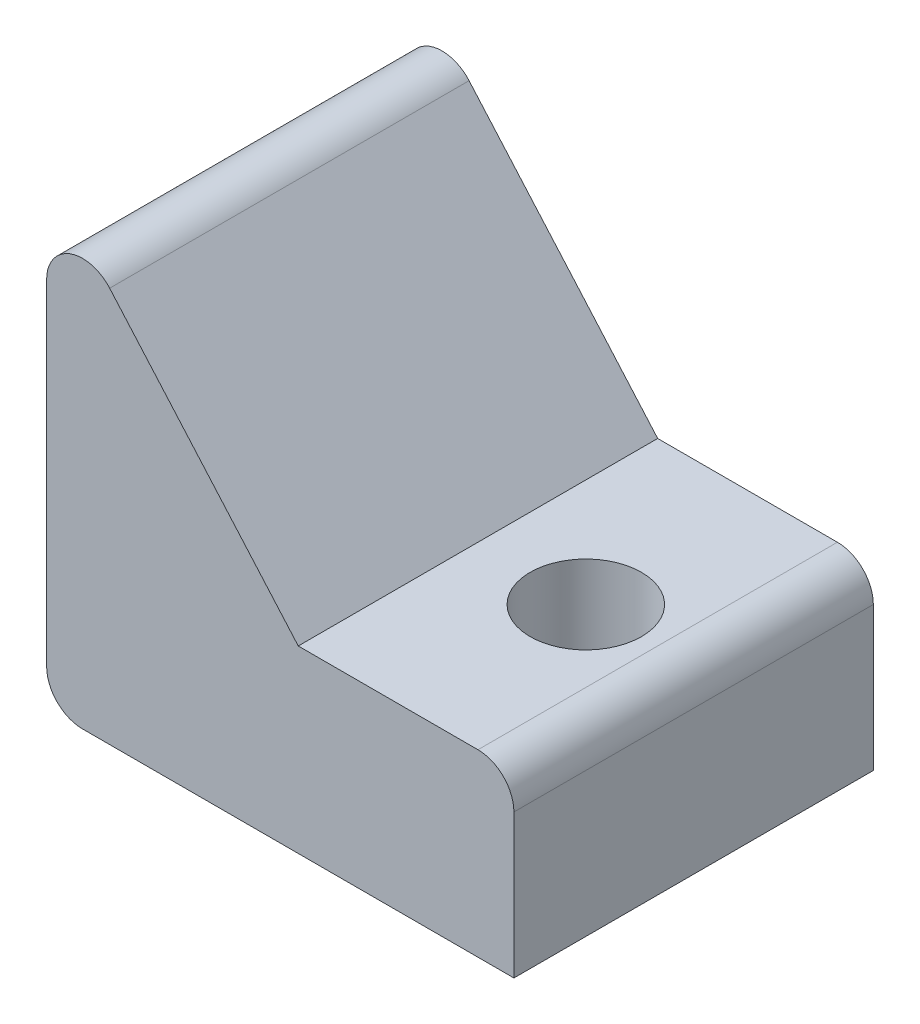
ISO-10303-21;
HEADER;
FILE_DESCRIPTION(('STEP AP214'),'2;1');
FILE_NAME('part.step','',(''),(''),'','','');
FILE_SCHEMA(('AUTOMOTIVE_DESIGN { 1 0 10303 214 1 1 1 1 }'));
ENDSEC;
DATA;
#1=APPLICATION_CONTEXT('core data for automotive mechanical design processes');
#2=APPLICATION_PROTOCOL_DEFINITION('international standard','automotive_design',2000,#1);
#3=PRODUCT_CONTEXT('',#1,'mechanical');
#4=PRODUCT('Part','Part','',(#3));
#5=PRODUCT_RELATED_PRODUCT_CATEGORY('part','',(#4));
#6=PRODUCT_DEFINITION_FORMATION('','',#4);
#7=PRODUCT_DEFINITION_CONTEXT('part definition',#1,'design');
#8=PRODUCT_DEFINITION('design','',#6,#7);
#9=PRODUCT_DEFINITION_SHAPE('','',#8);
#10=(LENGTH_UNIT() NAMED_UNIT(*) SI_UNIT(.MILLI.,.METRE.));
#11=(NAMED_UNIT(*) PLANE_ANGLE_UNIT() SI_UNIT($,.RADIAN.));
#12=(NAMED_UNIT(*) SI_UNIT($,.STERADIAN.) SOLID_ANGLE_UNIT());
#13=UNCERTAINTY_MEASURE_WITH_UNIT(LENGTH_MEASURE(1.E-05),#10,'distance_accuracy_value','');
#14=(GEOMETRIC_REPRESENTATION_CONTEXT(3) GLOBAL_UNCERTAINTY_ASSIGNED_CONTEXT((#13)) GLOBAL_UNIT_ASSIGNED_CONTEXT((#10,
#11,#12)) REPRESENTATION_CONTEXT('',''));
#15=CARTESIAN_POINT('',(0.,0.,0.));
#16=DIRECTION('',(0.,0.,1.));
#17=DIRECTION('',(1.,0.,0.));
#18=AXIS2_PLACEMENT_3D('',#15,#16,#17);
#19=CARTESIAN_POINT('',(13.,0.,5.));
#20=DIRECTION('',(-1.,0.,0.));
#21=DIRECTION('',(0.,0.,1.));
#22=AXIS2_PLACEMENT_3D('',#19,#20,#21);
#23=PLANE('',#22);
#24=DIRECTION('',(0.,1.,0.));
#25=VECTOR('',#24,1.);
#26=CARTESIAN_POINT('',(13.,0.,-5.));
#27=LINE('',#26,#25);
#28=CARTESIAN_POINT('',(13.,0.,-5.));
#29=VERTEX_POINT('',#28);
#30=CARTESIAN_POINT('',(13.,4.,-5.));
#31=VERTEX_POINT('',#30);
#32=EDGE_CURVE('E140',#29,#31,#27,.T.);
#33=ORIENTED_EDGE('',*,*,#32,.T.);
#34=DIRECTION('',(0.,0.,-1.));
#35=VECTOR('',#34,1.);
#36=CARTESIAN_POINT('',(13.,4.,5.));
#37=LINE('',#36,#35);
#38=CARTESIAN_POINT('',(13.,4.,5.));
#39=VERTEX_POINT('',#38);
#40=EDGE_CURVE('E11',#39,#31,#37,.T.);
#41=ORIENTED_EDGE('',*,*,#40,.F.);
#42=DIRECTION('',(0.,1.,0.));
#43=VECTOR('',#42,1.);
#44=CARTESIAN_POINT('',(13.,0.,5.));
#45=LINE('',#44,#43);
#46=CARTESIAN_POINT('',(13.,0.,5.));
#47=VERTEX_POINT('',#46);
#48=EDGE_CURVE('E163',#47,#39,#45,.T.);
#49=ORIENTED_EDGE('',*,*,#48,.F.);
#50=DIRECTION('',(0.,0.,-1.));
#51=VECTOR('',#50,1.);
#52=CARTESIAN_POINT('',(13.,0.,5.));
#53=LINE('',#52,#51);
#54=EDGE_CURVE('E136',#47,#29,#53,.T.);
#55=ORIENTED_EDGE('',*,*,#54,.T.);
#56=EDGE_LOOP('',(#33,#41,#49,#55));
#57=FACE_BOUND('',#56,.T.);
#58=ADVANCED_FACE('F39',(#57),#23,.F.);
#59=CARTESIAN_POINT('',(12.,4.,5.));
#60=DIRECTION('',(0.,0.,-1.));
#61=DIRECTION('',(-1.,0.,0.));
#62=AXIS2_PLACEMENT_3D('',#59,#60,#61);
#63=CYLINDRICAL_SURFACE('',#62,1.);
#64=CARTESIAN_POINT('',(12.,4.,-5.));
#65=DIRECTION('',(0.,0.,1.));
#66=DIRECTION('',(1.,0.,0.));
#67=AXIS2_PLACEMENT_3D('',#64,#65,#66);
#68=CIRCLE('',#67,1.);
#69=CARTESIAN_POINT('',(12.,5.,-5.));
#70=VERTEX_POINT('',#69);
#71=EDGE_CURVE('E144',#31,#70,#68,.T.);
#72=ORIENTED_EDGE('',*,*,#71,.T.);
#73=DIRECTION('',(0.,0.,-1.));
#74=VECTOR('',#73,1.);
#75=CARTESIAN_POINT('',(12.,5.,5.));
#76=LINE('',#75,#74);
#77=CARTESIAN_POINT('',(12.,5.,5.));
#78=VERTEX_POINT('',#77);
#79=EDGE_CURVE('E48',#78,#70,#76,.T.);
#80=ORIENTED_EDGE('',*,*,#79,.F.);
#81=CARTESIAN_POINT('',(12.,4.,5.));
#82=DIRECTION('',(0.,0.,1.));
#83=DIRECTION('',(1.,0.,0.));
#84=AXIS2_PLACEMENT_3D('',#81,#82,#83);
#85=CIRCLE('',#84,1.);
#86=EDGE_CURVE('E99',#39,#78,#85,.T.);
#87=ORIENTED_EDGE('',*,*,#86,.F.);
#88=ORIENTED_EDGE('',*,*,#40,.T.);
#89=EDGE_LOOP('',(#72,#80,#87,#88));
#90=FACE_BOUND('',#89,.T.);
#91=ADVANCED_FACE('F229',(#90),#63,.T.);
#92=CARTESIAN_POINT('',(12.,5.,5.));
#93=DIRECTION('',(0.,-1.,0.));
#94=DIRECTION('',(1.,0.,0.));
#95=AXIS2_PLACEMENT_3D('',#92,#93,#94);
#96=PLANE('',#95);
#97=CARTESIAN_POINT('',(10.,5.,0.));
#98=DIRECTION('',(0.,-1.,0.));
#99=DIRECTION('',(1.,0.,0.));
#100=AXIS2_PLACEMENT_3D('',#97,#98,#99);
#101=CIRCLE('',#100,1.55);
#102=CARTESIAN_POINT('',(11.55,5.,0.));
#103=VERTEX_POINT('',#102);
#104=EDGE_CURVE('E145',#103,#103,#101,.T.);
#105=ORIENTED_EDGE('',*,*,#104,.T.);
#106=EDGE_LOOP('',(#105));
#107=FACE_BOUND('',#106,.T.);
#108=DIRECTION('',(-1.,0.,0.));
#109=VECTOR('',#108,1.);
#110=CARTESIAN_POINT('',(12.,5.,-5.));
#111=LINE('',#110,#109);
#112=CARTESIAN_POINT('',(7.,5.,-5.));
#113=VERTEX_POINT('',#112);
#114=EDGE_CURVE('E148',#70,#113,#111,.T.);
#115=ORIENTED_EDGE('',*,*,#114,.T.);
#116=DIRECTION('',(0.,0.,-1.));
#117=VECTOR('',#116,1.);
#118=CARTESIAN_POINT('',(7.,5.,5.));
#119=LINE('',#118,#117);
#120=CARTESIAN_POINT('',(7.,5.,5.));
#121=VERTEX_POINT('',#120);
#122=EDGE_CURVE('E174',#121,#113,#119,.T.);
#123=ORIENTED_EDGE('',*,*,#122,.F.);
#124=DIRECTION('',(-1.,0.,0.));
#125=VECTOR('',#124,1.);
#126=CARTESIAN_POINT('',(12.,5.,5.));
#127=LINE('',#126,#125);
#128=EDGE_CURVE('E184',#78,#121,#127,.T.);
#129=ORIENTED_EDGE('',*,*,#128,.F.);
#130=ORIENTED_EDGE('',*,*,#79,.T.);
#131=EDGE_LOOP('',(#115,#123,#129,#130));
#132=FACE_BOUND('',#131,.T.);
#133=ADVANCED_FACE('F182',(#107,#132),#96,.F.);
#134=CARTESIAN_POINT('',(1.75257669470688,10.9970552060493,5.));
#135=DIRECTION('',(-0.752576694706878,-0.658504607868518,0.));
#136=DIRECTION('',(0.658504607868518,-0.752576694706878,0.));
#137=AXIS2_PLACEMENT_3D('',#134,#135,#136);
#138=PLANE('',#137);
#139=DIRECTION('',(-0.658504607868518,0.752576694706878,0.));
#140=VECTOR('',#139,1.);
#141=CARTESIAN_POINT('',(1.75257669470688,10.9970552060493,-5.));
#142=LINE('',#141,#140);
#143=CARTESIAN_POINT('',(1.75257669470688,10.9970552060493,-5.));
#144=VERTEX_POINT('',#143);
#145=EDGE_CURVE('E151',#113,#144,#142,.T.);
#146=ORIENTED_EDGE('',*,*,#145,.T.);
#147=DIRECTION('',(0.,0.,-1.));
#148=VECTOR('',#147,1.);
#149=CARTESIAN_POINT('',(1.75257669470688,10.9970552060493,5.));
#150=LINE('',#149,#148);
#151=CARTESIAN_POINT('',(1.75257669470688,10.9970552060493,5.));
#152=VERTEX_POINT('',#151);
#153=EDGE_CURVE('E170',#152,#144,#150,.T.);
#154=ORIENTED_EDGE('',*,*,#153,.F.);
#155=DIRECTION('',(-0.658504607868518,0.752576694706878,0.));
#156=VECTOR('',#155,1.);
#157=CARTESIAN_POINT('',(1.75257669470688,10.9970552060493,5.));
#158=LINE('',#157,#156);
#159=EDGE_CURVE('E197',#121,#152,#158,.T.);
#160=ORIENTED_EDGE('',*,*,#159,.F.);
#161=ORIENTED_EDGE('',*,*,#122,.T.);
#162=EDGE_LOOP('',(#146,#154,#160,#161));
#163=FACE_BOUND('',#162,.T.);
#164=ADVANCED_FACE('F192',(#163),#138,.F.);
#165=CARTESIAN_POINT('',(1.,10.3385505981808,5.));
#166=DIRECTION('',(0.,0.,-1.));
#167=DIRECTION('',(-1.,0.,0.));
#168=AXIS2_PLACEMENT_3D('',#165,#166,#167);
#169=CYLINDRICAL_SURFACE('',#168,0.999999999999999);
#170=CARTESIAN_POINT('',(1.,10.3385505981808,-5.));
#171=DIRECTION('',(0.,0.,1.));
#172=DIRECTION('',(-1.,0.,0.));
#173=AXIS2_PLACEMENT_3D('',#170,#171,#172);
#174=CIRCLE('',#173,0.999999999999999);
#175=CARTESIAN_POINT('',(0.,10.3385505981808,-5.));
#176=VERTEX_POINT('',#175);
#177=EDGE_CURVE('E154',#144,#176,#174,.T.);
#178=ORIENTED_EDGE('',*,*,#177,.T.);
#179=DIRECTION('',(0.,0.,-1.));
#180=VECTOR('',#179,1.);
#181=CARTESIAN_POINT('',(0.,10.3385505981808,5.));
#182=LINE('',#181,#180);
#183=CARTESIAN_POINT('',(0.,10.3385505981808,5.));
#184=VERTEX_POINT('',#183);
#185=EDGE_CURVE('E129',#184,#176,#182,.T.);
#186=ORIENTED_EDGE('',*,*,#185,.F.);
#187=CARTESIAN_POINT('',(1.,10.3385505981808,5.));
#188=DIRECTION('',(0.,0.,1.));
#189=DIRECTION('',(-1.,0.,0.));
#190=AXIS2_PLACEMENT_3D('',#187,#188,#189);
#191=CIRCLE('',#190,0.999999999999999);
#192=EDGE_CURVE('E118',#152,#184,#191,.T.);
#193=ORIENTED_EDGE('',*,*,#192,.F.);
#194=ORIENTED_EDGE('',*,*,#153,.T.);
#195=EDGE_LOOP('',(#178,#186,#193,#194));
#196=FACE_BOUND('',#195,.T.);
#197=ADVANCED_FACE('F195',(#196),#169,.T.);
#198=CARTESIAN_POINT('',(0.,1.00000000000001,5.));
#199=DIRECTION('',(1.,0.,0.));
#200=DIRECTION('',(0.,0.,-1.));
#201=AXIS2_PLACEMENT_3D('',#198,#199,#200);
#202=PLANE('',#201);
#203=DIRECTION('',(0.,-1.,0.));
#204=VECTOR('',#203,1.);
#205=CARTESIAN_POINT('',(0.,1.00000000000001,-5.));
#206=LINE('',#205,#204);
#207=CARTESIAN_POINT('',(0.,1.,-5.));
#208=VERTEX_POINT('',#207);
#209=EDGE_CURVE('E127',#176,#208,#206,.T.);
#210=ORIENTED_EDGE('',*,*,#209,.T.);
#211=DIRECTION('',(0.,0.,-1.));
#212=VECTOR('',#211,1.);
#213=CARTESIAN_POINT('',(0.,1.,5.));
#214=LINE('',#213,#212);
#215=CARTESIAN_POINT('',(0.,1.,5.));
#216=VERTEX_POINT('',#215);
#217=EDGE_CURVE('E124',#216,#208,#214,.T.);
#218=ORIENTED_EDGE('',*,*,#217,.F.);
#219=DIRECTION('',(0.,-1.,0.));
#220=VECTOR('',#219,1.);
#221=CARTESIAN_POINT('',(0.,1.00000000000001,5.));
#222=LINE('',#221,#220);
#223=EDGE_CURVE('E112',#184,#216,#222,.T.);
#224=ORIENTED_EDGE('',*,*,#223,.F.);
#225=ORIENTED_EDGE('',*,*,#185,.T.);
#226=EDGE_LOOP('',(#210,#218,#224,#225));
#227=FACE_BOUND('',#226,.T.);
#228=ADVANCED_FACE('F125',(#227),#202,.F.);
#229=CARTESIAN_POINT('',(1.,1.,5.));
#230=DIRECTION('',(0.,0.,-1.));
#231=DIRECTION('',(-1.,0.,0.));
#232=AXIS2_PLACEMENT_3D('',#229,#230,#231);
#233=CYLINDRICAL_SURFACE('',#232,1.);
#234=CARTESIAN_POINT('',(1.,1.,-5.));
#235=DIRECTION('',(0.,0.,1.));
#236=DIRECTION('',(-1.,0.,0.));
#237=AXIS2_PLACEMENT_3D('',#234,#235,#236);
#238=CIRCLE('',#237,1.);
#239=CARTESIAN_POINT('',(1.00000000000001,0.,-5.));
#240=VERTEX_POINT('',#239);
#241=EDGE_CURVE('E85',#208,#240,#238,.T.);
#242=ORIENTED_EDGE('',*,*,#241,.T.);
#243=DIRECTION('',(0.,0.,-1.));
#244=VECTOR('',#243,1.);
#245=CARTESIAN_POINT('',(1.00000000000001,0.,5.));
#246=LINE('',#245,#244);
#247=CARTESIAN_POINT('',(1.00000000000001,0.,5.));
#248=VERTEX_POINT('',#247);
#249=EDGE_CURVE('E130',#248,#240,#246,.T.);
#250=ORIENTED_EDGE('',*,*,#249,.F.);
#251=CARTESIAN_POINT('',(1.,1.,5.));
#252=DIRECTION('',(0.,0.,1.));
#253=DIRECTION('',(-1.,0.,0.));
#254=AXIS2_PLACEMENT_3D('',#251,#252,#253);
#255=CIRCLE('',#254,1.);
#256=EDGE_CURVE('E116',#216,#248,#255,.T.);
#257=ORIENTED_EDGE('',*,*,#256,.F.);
#258=ORIENTED_EDGE('',*,*,#217,.T.);
#259=EDGE_LOOP('',(#242,#250,#257,#258));
#260=FACE_BOUND('',#259,.T.);
#261=ADVANCED_FACE('F132',(#260),#233,.T.);
#262=CARTESIAN_POINT('',(1.00000000000001,0.,5.));
#263=DIRECTION('',(0.,1.,0.));
#264=DIRECTION('',(0.,0.,1.));
#265=AXIS2_PLACEMENT_3D('',#262,#263,#264);
#266=PLANE('',#265);
#267=CARTESIAN_POINT('',(10.,0.,0.));
#268=DIRECTION('',(0.,-1.,0.));
#269=DIRECTION('',(0.,0.,-1.));
#270=AXIS2_PLACEMENT_3D('',#267,#268,#269);
#271=CIRCLE('',#270,1.55);
#272=CARTESIAN_POINT('',(10.,0.,-1.55));
#273=VERTEX_POINT('',#272);
#274=EDGE_CURVE('E210',#273,#273,#271,.T.);
#275=ORIENTED_EDGE('',*,*,#274,.F.);
#276=EDGE_LOOP('',(#275));
#277=FACE_BOUND('',#276,.T.);
#278=DIRECTION('',(1.,0.,0.));
#279=VECTOR('',#278,1.);
#280=CARTESIAN_POINT('',(1.00000000000001,0.,-5.));
#281=LINE('',#280,#279);
#282=EDGE_CURVE('E91',#240,#29,#281,.T.);
#283=ORIENTED_EDGE('',*,*,#282,.T.);
#284=ORIENTED_EDGE('',*,*,#54,.F.);
#285=DIRECTION('',(1.,0.,0.));
#286=VECTOR('',#285,1.);
#287=CARTESIAN_POINT('',(1.00000000000001,0.,5.));
#288=LINE('',#287,#286);
#289=EDGE_CURVE('E56',#248,#47,#288,.T.);
#290=ORIENTED_EDGE('',*,*,#289,.F.);
#291=ORIENTED_EDGE('',*,*,#249,.T.);
#292=EDGE_LOOP('',(#283,#284,#290,#291));
#293=FACE_BOUND('',#292,.T.);
#294=ADVANCED_FACE('F218',(#277,#293),#266,.F.);
#295=CARTESIAN_POINT('',(12.,4.,5.));
#296=DIRECTION('',(0.,0.,1.));
#297=DIRECTION('',(1.,0.,0.));
#298=AXIS2_PLACEMENT_3D('',#295,#296,#297);
#299=PLANE('',#298);
#300=ORIENTED_EDGE('',*,*,#48,.T.);
#301=ORIENTED_EDGE('',*,*,#86,.T.);
#302=ORIENTED_EDGE('',*,*,#128,.T.);
#303=ORIENTED_EDGE('',*,*,#159,.T.);
#304=ORIENTED_EDGE('',*,*,#192,.T.);
#305=ORIENTED_EDGE('',*,*,#223,.T.);
#306=ORIENTED_EDGE('',*,*,#256,.T.);
#307=ORIENTED_EDGE('',*,*,#289,.T.);
#308=EDGE_LOOP('',(#300,#301,#302,#303,#304,#305,#306,#307));
#309=FACE_BOUND('',#308,.T.);
#310=ADVANCED_FACE('F114',(#309),#299,.T.);
#311=CARTESIAN_POINT('',(12.,4.,-5.));
#312=DIRECTION('',(0.,0.,1.));
#313=DIRECTION('',(1.,0.,0.));
#314=AXIS2_PLACEMENT_3D('',#311,#312,#313);
#315=PLANE('',#314);
#316=ORIENTED_EDGE('',*,*,#32,.F.);
#317=ORIENTED_EDGE('',*,*,#282,.F.);
#318=ORIENTED_EDGE('',*,*,#241,.F.);
#319=ORIENTED_EDGE('',*,*,#209,.F.);
#320=ORIENTED_EDGE('',*,*,#177,.F.);
#321=ORIENTED_EDGE('',*,*,#145,.F.);
#322=ORIENTED_EDGE('',*,*,#114,.F.);
#323=ORIENTED_EDGE('',*,*,#71,.F.);
#324=EDGE_LOOP('',(#316,#317,#318,#319,#320,#321,#322,#323));
#325=FACE_BOUND('',#324,.T.);
#326=ADVANCED_FACE('F188',(#325),#315,.F.);
#327=CARTESIAN_POINT('',(10.,10.,0.));
#328=DIRECTION('',(0.,-1.,0.));
#329=DIRECTION('',(0.,0.,-1.));
#330=AXIS2_PLACEMENT_3D('',#327,#328,#329);
#331=CYLINDRICAL_SURFACE('',#330,1.55);
#332=ORIENTED_EDGE('',*,*,#274,.T.);
#333=EDGE_LOOP('',(#332));
#334=FACE_BOUND('',#333,.T.);
#335=ORIENTED_EDGE('',*,*,#104,.F.);
#336=EDGE_LOOP('',(#335));
#337=FACE_BOUND('',#336,.T.);
#338=ADVANCED_FACE('F215',(#334,#337),#331,.F.);
#339=CLOSED_SHELL('',(#58,#91,#133,#164,#197,#228,#261,#294,#310,#326,#338));
#340=MANIFOLD_SOLID_BREP('B2',#339);
#341=ADVANCED_BREP_SHAPE_REPRESENTATION('',(#18,#340),#14);
#342=SHAPE_DEFINITION_REPRESENTATION(#9,#341);
ENDSEC;
END-ISO-10303-21;
